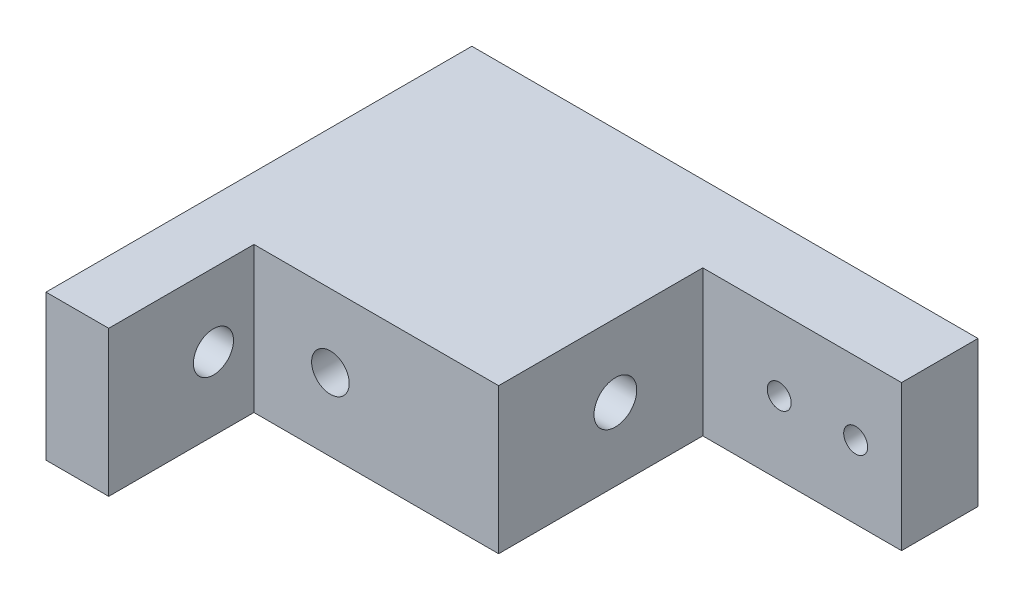
ISO-10303-21;
HEADER;
FILE_DESCRIPTION(('STEP AP214'),'2;1');
FILE_NAME('part.step','',(''),(''),'','','');
FILE_SCHEMA(('AUTOMOTIVE_DESIGN { 1 0 10303 214 1 1 1 1 }'));
ENDSEC;
DATA;
#1=APPLICATION_CONTEXT('core data for automotive mechanical design processes');
#2=APPLICATION_PROTOCOL_DEFINITION('international standard','automotive_design',2000,#1);
#3=PRODUCT_CONTEXT('',#1,'mechanical');
#4=PRODUCT('Part','Part','',(#3));
#5=PRODUCT_RELATED_PRODUCT_CATEGORY('part','',(#4));
#6=PRODUCT_DEFINITION_FORMATION('','',#4);
#7=PRODUCT_DEFINITION_CONTEXT('part definition',#1,'design');
#8=PRODUCT_DEFINITION('design','',#6,#7);
#9=PRODUCT_DEFINITION_SHAPE('','',#8);
#10=(LENGTH_UNIT() NAMED_UNIT(*) SI_UNIT(.MILLI.,.METRE.));
#11=(NAMED_UNIT(*) PLANE_ANGLE_UNIT() SI_UNIT($,.RADIAN.));
#12=(NAMED_UNIT(*) SI_UNIT($,.STERADIAN.) SOLID_ANGLE_UNIT());
#13=UNCERTAINTY_MEASURE_WITH_UNIT(LENGTH_MEASURE(1.E-05),#10,'distance_accuracy_value','');
#14=(GEOMETRIC_REPRESENTATION_CONTEXT(3) GLOBAL_UNCERTAINTY_ASSIGNED_CONTEXT((#13)) GLOBAL_UNIT_ASSIGNED_CONTEXT((#10,
#11,#12)) REPRESENTATION_CONTEXT('',''));
#15=CARTESIAN_POINT('',(0.,0.,0.));
#16=DIRECTION('',(0.,0.,1.));
#17=DIRECTION('',(1.,0.,0.));
#18=AXIS2_PLACEMENT_3D('',#15,#16,#17);
#19=CARTESIAN_POINT('',(-14.5000000000011,0.,18.35));
#20=DIRECTION('',(0.,0.,-1.));
#21=DIRECTION('',(-1.,0.,0.));
#22=AXIS2_PLACEMENT_3D('',#19,#20,#21);
#23=CYLINDRICAL_SURFACE('',#22,1.2295);
#24=CARTESIAN_POINT('',(-15.7295000000011,0.,12.11072));
#25=CARTESIAN_POINT('',(-15.7294971628794,0.0574160828575037,12.1107172084444));
#26=CARTESIAN_POINT('',(-15.725447597035,0.114853620395307,12.1071494421535));
#27=CARTESIAN_POINT('',(-15.7095622145933,0.22779522475085,12.0932001820455));
#28=CARTESIAN_POINT('',(-15.6977200223506,0.283297669158507,12.082813108934));
#29=CARTESIAN_POINT('',(-15.6671756759797,0.390460017000292,12.0561738043992));
#30=CARTESIAN_POINT('',(-15.6485164003282,0.442141561815172,12.0399582434197));
#31=CARTESIAN_POINT('',(-15.6053454161826,0.541112177611661,12.0027538435224));
#32=CARTESIAN_POINT('',(-15.5808315281367,0.588399603624564,11.9817632270883));
#33=CARTESIAN_POINT('',(-15.5163990974183,0.695625552128031,11.9272280341287));
#34=CARTESIAN_POINT('',(-15.4741983708461,0.753324768266293,11.8919770714443));
#35=CARTESIAN_POINT('',(-15.382252384163,0.85921103088047,11.8171650108562));
#36=CARTESIAN_POINT('',(-15.3324877297995,0.907372870275045,11.7775929089871));
#37=CARTESIAN_POINT('',(-15.2252952161145,0.995255821208242,11.6959264647508));
#38=CARTESIAN_POINT('',(-15.1677222171879,1.03476669902257,11.6537956957879));
#39=CARTESIAN_POINT('',(-15.0763071741527,1.08662780090079,11.5921140078755));
#40=CARTESIAN_POINT('',(-15.0450112752951,1.10267392197675,11.5718164730113));
#41=CARTESIAN_POINT('',(-14.9805604123032,1.13224972657545,11.5323919354883));
#42=CARTESIAN_POINT('',(-14.9474068465628,1.14578127073271,11.5132640744302));
#43=CARTESIAN_POINT('',(-14.8782454432165,1.17046137741388,11.4766919129135));
#44=CARTESIAN_POINT('',(-14.8421901224963,1.18154937140915,11.4592952620302));
#45=CARTESIAN_POINT('',(-14.7677341187612,1.20060793588835,11.4282004087307));
#46=CARTESIAN_POINT('',(-14.729337742641,1.2085840425394,11.4144956518676));
#47=CARTESIAN_POINT('',(-14.656613997595,1.21994708356748,11.3944925690182));
#48=CARTESIAN_POINT('',(-14.6226068181303,1.2238611571338,11.3873644202599));
#49=CARTESIAN_POINT('',(-14.5537203978819,1.22880876155988,11.3783006206414));
#50=CARTESIAN_POINT('',(-14.5188428294954,1.22984744310206,11.3763556853378));
#51=CARTESIAN_POINT('',(-14.449235156809,1.22894534761646,11.3780259149758));
#52=CARTESIAN_POINT('',(-14.4145052225802,1.22700176006842,11.3816463247601));
#53=CARTESIAN_POINT('',(-14.3461665448166,1.2203239268568,11.3937673298831));
#54=CARTESIAN_POINT('',(-14.3125602562233,1.21558394528848,11.402277954992));
#55=CARTESIAN_POINT('',(-14.2281902700906,1.20022631305768,11.428849207177));
#56=CARTESIAN_POINT('',(-14.1786264987078,1.18779708988803,11.449587726825));
#57=CARTESIAN_POINT('',(-14.0833809340689,1.157847404093,11.495873334206));
#58=CARTESIAN_POINT('',(-14.0377165315095,1.14030553162739,11.5214404805818));
#59=CARTESIAN_POINT('',(-13.9573580319584,1.10399314572425,11.5702080523947));
#60=CARTESIAN_POINT('',(-13.9221229901944,1.08594521222661,11.5930659836141));
#61=CARTESIAN_POINT('',(-13.8538292117362,1.04674979450679,11.6393803923189));
#62=CARTESIAN_POINT('',(-13.8207717966877,1.02560045264256,11.6628372215212));
#63=CARTESIAN_POINT('',(-13.7248196665767,0.957557390597827,11.7329938451918));
#64=CARTESIAN_POINT('',(-13.6650036404977,0.90600419070033,11.7795720257937));
#65=CARTESIAN_POINT('',(-13.5667134561113,0.80284331834285,11.8584140406088));
#66=CARTESIAN_POINT('',(-13.5264208788622,0.753655888728642,11.891595786182));
#67=CARTESIAN_POINT('',(-13.4528731004327,0.647567944098002,11.9530756547717));
#68=CARTESIAN_POINT('',(-13.4196052951011,0.590681549195058,11.9813825074037));
#69=CARTESIAN_POINT('',(-13.367494812565,0.481665305231734,12.026110031191));
#70=CARTESIAN_POINT('',(-13.3471026696086,0.430790512484509,12.0437730471399));
#71=CARTESIAN_POINT('',(-13.3130100284197,0.325257384327522,12.0734304343933));
#72=CARTESIAN_POINT('',(-13.2993055872832,0.270601300031124,12.0854281456859));
#73=CARTESIAN_POINT('',(-13.2794332916372,0.158555610800743,12.1028560032691));
#74=CARTESIAN_POINT('',(-13.2733089695027,0.101152165318687,12.1082482125802));
#75=CARTESIAN_POINT('',(-13.2692300617506,-0.0141660227984621,12.1118373813138));
#76=CARTESIAN_POINT('',(-13.2712731282219,-0.0720806137163305,12.1100364085884));
#77=CARTESIAN_POINT('',(-13.2827855558014,-0.181058343022418,12.0999175130995));
#78=CARTESIAN_POINT('',(-13.2915475060649,-0.232258216983461,12.0922204489114));
#79=CARTESIAN_POINT('',(-13.3151014483981,-0.332145693061513,12.071619417203));
#80=CARTESIAN_POINT('',(-13.3298949133235,-0.380832678273931,12.0587141778887));
#81=CARTESIAN_POINT('',(-13.365792227337,-0.477556607067068,12.0276001059946));
#82=CARTESIAN_POINT('',(-13.3872159714869,-0.525387007041992,12.0091240478556));
#83=CARTESIAN_POINT('',(-13.4350596333528,-0.616627643180781,11.968264685052));
#84=CARTESIAN_POINT('',(-13.4614805945147,-0.660036953279628,11.9458805644381));
#85=CARTESIAN_POINT('',(-13.5332047037817,-0.763359437949203,11.8859249712742));
#86=CARTESIAN_POINT('',(-13.581233073022,-0.820287336115386,11.8464609105656));
#87=CARTESIAN_POINT('',(-13.6852151785228,-0.923696498379453,11.7638571047708));
#88=CARTESIAN_POINT('',(-13.7412043951293,-0.97012844481608,11.7207012689177));
#89=CARTESIAN_POINT('',(-13.8312156582282,-1.03235885452418,11.6554103570316));
#90=CARTESIAN_POINT('',(-13.8626288346439,-1.05205105579965,11.6332914533623));
#91=CARTESIAN_POINT('',(-13.927405139645,-1.08866452952587,11.5896353300191));
#92=CARTESIAN_POINT('',(-13.9607672661679,-1.10558720921832,11.5680978196042));
#93=CARTESIAN_POINT('',(-14.0294606713015,-1.13651925696257,11.5264938271602));
#94=CARTESIAN_POINT('',(-14.0647822012257,-1.15054164955713,11.5064210427236));
#95=CARTESIAN_POINT('',(-14.1377434484412,-1.17555285993584,11.4688304251084));
#96=CARTESIAN_POINT('',(-14.1753787580722,-1.18654723955969,11.4513079358677));
#97=CARTESIAN_POINT('',(-14.2481327160123,-1.20392756748542,11.4225314452762));
#98=CARTESIAN_POINT('',(-14.2829396037183,-1.21072749941449,11.4107579938049));
#99=CARTESIAN_POINT('',(-14.3542008486416,-1.22135267783463,11.3919717918991));
#100=CARTESIAN_POINT('',(-14.390649529448,-1.22518744901115,11.3849438073805));
#101=CARTESIAN_POINT('',(-14.4648182890826,-1.22956131224226,11.3769041519847));
#102=CARTESIAN_POINT('',(-14.502547426209,-1.23006713117102,11.3759532244615));
#103=CARTESIAN_POINT('',(-14.5775313894619,-1.22762861837186,11.3804591587758));
#104=CARTESIAN_POINT('',(-14.6147854226483,-1.22467913036241,11.3859255971384));
#105=CARTESIAN_POINT('',(-14.6961609594903,-1.21459707746898,11.4040011676949));
#106=CARTESIAN_POINT('',(-14.7398616698676,-1.20665040103913,11.4179770918789));
#107=CARTESIAN_POINT('',(-14.8243631790112,-1.18674288264137,11.4510261459966));
#108=CARTESIAN_POINT('',(-14.8651525663656,-1.17476719465706,11.4701180735345));
#109=CARTESIAN_POINT('',(-14.9395217104356,-1.14885133124427,11.5088502298677));
#110=CARTESIAN_POINT('',(-14.9733960381866,-1.13528436964147,11.5281864752751));
#111=CARTESIAN_POINT('',(-15.0392116048768,-1.10554288010942,11.5681241751178));
#112=CARTESIAN_POINT('',(-15.0711514288259,-1.08936647444567,11.5887265339794));
#113=CARTESIAN_POINT('',(-15.1643736296446,-1.03700216853202,11.6513692305223));
#114=CARTESIAN_POINT('',(-15.2230155554015,-0.996994616548256,11.6942204711286));
#115=CARTESIAN_POINT('',(-15.3365882389955,-0.904145636089737,11.7806857926917));
#116=CARTESIAN_POINT('',(-15.3910930998108,-0.850684140004481,11.8241945816177));
#117=CARTESIAN_POINT('',(-15.490754408494,-0.732139655236624,11.9056582841307));
#118=CARTESIAN_POINT('',(-15.5359387755064,-0.667092494838428,11.9436296815673));
#119=CARTESIAN_POINT('',(-15.6015740460948,-0.548802839545224,11.9994944932316));
#120=CARTESIAN_POINT('',(-15.6252959240962,-0.498559971733186,12.0199076926397));
#121=CARTESIAN_POINT('',(-15.6661311549398,-0.393652434814946,12.0552469940517));
#122=CARTESIAN_POINT('',(-15.6832540047325,-0.338994258139256,12.0701809799338));
#123=CARTESIAN_POINT('',(-15.7073413985709,-0.237071082137791,12.0912487031872));
#124=CARTESIAN_POINT('',(-15.7156098157833,-0.190345538147439,12.0985084625955));
#125=CARTESIAN_POINT('',(-15.7266902109873,-0.0957516119569604,12.1082451974226));
#126=CARTESIAN_POINT('',(-15.7295023660744,-0.0478832669001068,12.1107223280725));
#127=CARTESIAN_POINT('',(-15.7295000000011,0.,12.11072));
#128=B_SPLINE_CURVE_WITH_KNOTS('',3,(#24,#25,#26,#27,#28,#29,#30,#31,#32,#33,#34,#35,#36,#37,
#38,#39,#40,#41,#42,#43,#44,#45,#46,#47,#48,#49,#50,#51,#52,#53,#54,#55,#56,#57,#58,#59,#60,#61,
#62,#63,#64,#65,#66,#67,#68,#69,#70,#71,#72,#73,#74,#75,#76,#77,#78,#79,#80,#81,#82,#83,#84,#85,
#86,#87,#88,#89,#90,#91,#92,#93,#94,#95,#96,#97,#98,#99,#100,#101,#102,#103,#104,#105,#106,#107,
#108,#109,#110,#111,#112,#113,#114,#115,#116,#117,#118,#119,#120,#121,#122,#123,#124,#125,#126,
#127),.UNSPECIFIED.,.T.,.F.,(4,2,2,2,2,2,2,2,2,2,2,2,2,2,2,2,2,2,2,2,2,2,2,2,2,2,2,2,2,2,2,2,2,
2,2,2,2,2,2,2,2,2,2,2,2,2,2,2,2,2,2,4),(0.,0.172043834961801,0.344228605279432,
0.515348496384726,0.686532191480826,0.924341804435361,1.16277179188363,1.40647493732299,
1.52819432498413,1.64982328589981,1.77419300770501,1.8983404509414,2.00280250219559,
2.10707730938603,2.2114504465715,2.31603841976129,2.48054159730912,2.64574380036374,
2.78270693199406,2.91975243769551,3.19330727284085,3.40773493606582,3.62177453179607,
3.79383807695892,3.96580005477482,4.13874508987135,4.31164041136031,4.46847651349755,
4.62535093692799,4.79144930155447,4.95758238678065,5.20910608566094,5.46178813593183,
5.59119728622028,5.7205404759501,5.84928955970604,5.97780055619575,6.08955413406358,
6.20094722853388,6.31345203611031,6.42612494632015,6.56503377364331,6.70446015980026,
6.82818188109059,6.95199303195352,7.19976995029561,7.46223100192175,7.72389406480201,
7.90081324446533,8.07747685264476,8.22096083578924,8.36444016175509),.UNSPECIFIED.);
#129=CARTESIAN_POINT('',(-15.7295000000011,0.,12.11072));
#130=VERTEX_POINT('',#129);
#131=EDGE_CURVE('E42',#130,#130,#128,.T.);
#132=ORIENTED_EDGE('',*,*,#131,.T.);
#133=EDGE_LOOP('',(#132));
#134=FACE_BOUND('',#133,.T.);
#135=CARTESIAN_POINT('',(-14.5000000000011,0.,18.35));
#136=DIRECTION('',(0.,0.,-1.));
#137=DIRECTION('',(-1.,0.,0.));
#138=AXIS2_PLACEMENT_3D('',#135,#136,#137);
#139=CIRCLE('',#138,1.2295);
#140=CARTESIAN_POINT('',(-15.7295000000011,0.,18.35));
#141=VERTEX_POINT('',#140);
#142=EDGE_CURVE('E222',#141,#141,#139,.T.);
#143=ORIENTED_EDGE('',*,*,#142,.F.);
#144=EDGE_LOOP('',(#143));
#145=FACE_BOUND('',#144,.T.);
#146=ADVANCED_FACE('F38',(#134,#145),#23,.F.);
#147=CARTESIAN_POINT('',(-23.6,4.76000000000001,27.85));
#148=DIRECTION('',(-1.,0.,0.));
#149=DIRECTION('',(0.,0.,1.));
#150=AXIS2_PLACEMENT_3D('',#147,#148,#149);
#151=PLANE('',#150);
#152=CARTESIAN_POINT('',(-23.6,0.,10.71372));
#153=DIRECTION('',(-1.,0.,0.));
#154=DIRECTION('',(0.,0.,1.));
#155=AXIS2_PLACEMENT_3D('',#152,#153,#154);
#156=CIRCLE('',#155,1.39699999999999);
#157=CARTESIAN_POINT('',(-23.6,0.,12.11072));
#158=VERTEX_POINT('',#157);
#159=EDGE_CURVE('E179',#158,#158,#156,.T.);
#160=ORIENTED_EDGE('',*,*,#159,.F.);
#161=EDGE_LOOP('',(#160));
#162=FACE_BOUND('',#161,.T.);
#163=CARTESIAN_POINT('',(-23.6,0.,21.));
#164=DIRECTION('',(1.,0.,0.));
#165=DIRECTION('',(0.,1.,0.));
#166=AXIS2_PLACEMENT_3D('',#163,#164,#165);
#167=CIRCLE('',#166,1.3105);
#168=CARTESIAN_POINT('',(-23.6,1.31050000000001,21.));
#169=VERTEX_POINT('',#168);
#170=EDGE_CURVE('E223',#169,#169,#167,.T.);
#171=ORIENTED_EDGE('',*,*,#170,.T.);
#172=EDGE_LOOP('',(#171));
#173=FACE_BOUND('',#172,.T.);
#174=DIRECTION('',(0.,0.,-1.));
#175=VECTOR('',#174,1.);
#176=CARTESIAN_POINT('',(-23.6,-4.75999999999999,27.85));
#177=LINE('',#176,#175);
#178=CARTESIAN_POINT('',(-23.6,-4.75999999999999,27.85));
#179=VERTEX_POINT('',#178);
#180=CARTESIAN_POINT('',(-23.6,-4.75999999999999,0.));
#181=VERTEX_POINT('',#180);
#182=EDGE_CURVE('E149',#179,#181,#177,.T.);
#183=ORIENTED_EDGE('',*,*,#182,.F.);
#184=DIRECTION('',(0.,-1.,0.));
#185=VECTOR('',#184,1.);
#186=CARTESIAN_POINT('',(-23.6,4.76000000000001,27.85));
#187=LINE('',#186,#185);
#188=CARTESIAN_POINT('',(-23.6,4.76000000000001,27.85));
#189=VERTEX_POINT('',#188);
#190=EDGE_CURVE('E11',#189,#179,#187,.T.);
#191=ORIENTED_EDGE('',*,*,#190,.F.);
#192=DIRECTION('',(0.,0.,-1.));
#193=VECTOR('',#192,1.);
#194=CARTESIAN_POINT('',(-23.6,4.76000000000001,27.85));
#195=LINE('',#194,#193);
#196=CARTESIAN_POINT('',(-23.6,4.76000000000001,0.));
#197=VERTEX_POINT('',#196);
#198=EDGE_CURVE('E151',#189,#197,#195,.T.);
#199=ORIENTED_EDGE('',*,*,#198,.T.);
#200=DIRECTION('',(0.,-1.,0.));
#201=VECTOR('',#200,1.);
#202=CARTESIAN_POINT('',(-23.6,4.76000000000001,0.));
#203=LINE('',#202,#201);
#204=EDGE_CURVE('E163',#197,#181,#203,.T.);
#205=ORIENTED_EDGE('',*,*,#204,.T.);
#206=EDGE_LOOP('',(#183,#191,#199,#205));
#207=FACE_BOUND('',#206,.T.);
#208=ADVANCED_FACE('F40',(#162,#173,#207),#151,.T.);
#209=CARTESIAN_POINT('',(9.49999999994784,4.76000000000001,27.85));
#210=DIRECTION('',(0.,0.,1.));
#211=DIRECTION('',(1.,0.,0.));
#212=AXIS2_PLACEMENT_3D('',#209,#210,#211);
#213=PLANE('',#212);
#214=DIRECTION('',(0.,1.,0.));
#215=VECTOR('',#214,1.);
#216=CARTESIAN_POINT('',(-19.5000000000011,-4.76,27.85));
#217=LINE('',#216,#215);
#218=CARTESIAN_POINT('',(-19.5000000000011,-4.76,27.85));
#219=VERTEX_POINT('',#218);
#220=CARTESIAN_POINT('',(-19.5000000000011,4.76000000000001,27.85));
#221=VERTEX_POINT('',#220);
#222=EDGE_CURVE('E115',#219,#221,#217,.T.);
#223=ORIENTED_EDGE('',*,*,#222,.T.);
#224=DIRECTION('',(-1.,0.,0.));
#225=VECTOR('',#224,1.);
#226=CARTESIAN_POINT('',(9.49999999994784,4.76000000000001,27.85));
#227=LINE('',#226,#225);
#228=EDGE_CURVE('E161',#221,#189,#227,.T.);
#229=ORIENTED_EDGE('',*,*,#228,.T.);
#230=ORIENTED_EDGE('',*,*,#190,.T.);
#231=DIRECTION('',(-1.,0.,0.));
#232=VECTOR('',#231,1.);
#233=CARTESIAN_POINT('',(9.49999999994784,-4.75999999999999,27.85));
#234=LINE('',#233,#232);
#235=EDGE_CURVE('E155',#219,#179,#234,.T.);
#236=ORIENTED_EDGE('',*,*,#235,.F.);
#237=EDGE_LOOP('',(#223,#229,#230,#236));
#238=FACE_BOUND('',#237,.T.);
#239=ADVANCED_FACE('F207',(#238),#213,.T.);
#240=CARTESIAN_POINT('',(9.49999999994784,4.76000000000001,0.));
#241=DIRECTION('',(1.,0.,0.));
#242=DIRECTION('',(0.,0.,-1.));
#243=AXIS2_PLACEMENT_3D('',#240,#241,#242);
#244=PLANE('',#243);
#245=DIRECTION('',(0.,1.,0.));
#246=VECTOR('',#245,1.);
#247=CARTESIAN_POINT('',(9.49999999994784,-4.75999999999999,5.00000000070027));
#248=LINE('',#247,#246);
#249=CARTESIAN_POINT('',(9.49999999994784,-4.75999999999999,5.00000000070027));
#250=VERTEX_POINT('',#249);
#251=CARTESIAN_POINT('',(9.49999999994784,4.76000000000001,5.00000000070027));
#252=VERTEX_POINT('',#251);
#253=EDGE_CURVE('E142',#250,#252,#248,.T.);
#254=ORIENTED_EDGE('',*,*,#253,.F.);
#255=DIRECTION('',(0.,0.,1.));
#256=VECTOR('',#255,1.);
#257=CARTESIAN_POINT('',(9.49999999994784,-4.75999999999999,0.));
#258=LINE('',#257,#256);
#259=CARTESIAN_POINT('',(9.49999999994784,-4.75999999999999,0.));
#260=VERTEX_POINT('',#259);
#261=EDGE_CURVE('E169',#260,#250,#258,.T.);
#262=ORIENTED_EDGE('',*,*,#261,.F.);
#263=DIRECTION('',(0.,-1.,0.));
#264=VECTOR('',#263,1.);
#265=CARTESIAN_POINT('',(9.49999999994784,4.76000000000001,0.));
#266=LINE('',#265,#264);
#267=CARTESIAN_POINT('',(9.49999999994784,4.76000000000001,0.));
#268=VERTEX_POINT('',#267);
#269=EDGE_CURVE('E52',#268,#260,#266,.T.);
#270=ORIENTED_EDGE('',*,*,#269,.F.);
#271=DIRECTION('',(0.,0.,1.));
#272=VECTOR('',#271,1.);
#273=CARTESIAN_POINT('',(9.49999999994784,4.76000000000001,0.));
#274=LINE('',#273,#272);
#275=EDGE_CURVE('E158',#268,#252,#274,.T.);
#276=ORIENTED_EDGE('',*,*,#275,.T.);
#277=EDGE_LOOP('',(#254,#262,#270,#276));
#278=FACE_BOUND('',#277,.T.);
#279=ADVANCED_FACE('F274',(#278),#244,.T.);
#280=CARTESIAN_POINT('',(-23.6,4.76000000000001,0.));
#281=DIRECTION('',(0.,0.,-1.));
#282=DIRECTION('',(-1.,0.,0.));
#283=AXIS2_PLACEMENT_3D('',#280,#281,#282);
#284=PLANE('',#283);
#285=CARTESIAN_POINT('',(1.5,0.,0.));
#286=DIRECTION('',(0.,0.,1.));
#287=DIRECTION('',(1.,0.,0.));
#288=AXIS2_PLACEMENT_3D('',#285,#286,#287);
#289=CIRCLE('',#288,0.7835);
#290=CARTESIAN_POINT('',(2.2835,0.,0.));
#291=VERTEX_POINT('',#290);
#292=EDGE_CURVE('E235',#291,#291,#289,.T.);
#293=ORIENTED_EDGE('',*,*,#292,.T.);
#294=EDGE_LOOP('',(#293));
#295=FACE_BOUND('',#294,.T.);
#296=CARTESIAN_POINT('',(6.5,0.,0.));
#297=DIRECTION('',(0.,0.,1.));
#298=DIRECTION('',(1.,0.,0.));
#299=AXIS2_PLACEMENT_3D('',#296,#297,#298);
#300=CIRCLE('',#299,0.7835);
#301=CARTESIAN_POINT('',(7.2835,0.,0.));
#302=VERTEX_POINT('',#301);
#303=EDGE_CURVE('E131',#302,#302,#300,.T.);
#304=ORIENTED_EDGE('',*,*,#303,.T.);
#305=EDGE_LOOP('',(#304));
#306=FACE_BOUND('',#305,.T.);
#307=DIRECTION('',(1.,0.,0.));
#308=VECTOR('',#307,1.);
#309=CARTESIAN_POINT('',(-23.6,-4.75999999999999,0.));
#310=LINE('',#309,#308);
#311=EDGE_CURVE('E166',#181,#260,#310,.T.);
#312=ORIENTED_EDGE('',*,*,#311,.F.);
#313=ORIENTED_EDGE('',*,*,#204,.F.);
#314=DIRECTION('',(1.,0.,0.));
#315=VECTOR('',#314,1.);
#316=CARTESIAN_POINT('',(-23.6,4.76000000000001,0.));
#317=LINE('',#316,#315);
#318=EDGE_CURVE('E154',#197,#268,#317,.T.);
#319=ORIENTED_EDGE('',*,*,#318,.T.);
#320=ORIENTED_EDGE('',*,*,#269,.T.);
#321=EDGE_LOOP('',(#312,#313,#319,#320));
#322=FACE_BOUND('',#321,.T.);
#323=ADVANCED_FACE('F244',(#295,#306,#322),#284,.T.);
#324=CARTESIAN_POINT('',(0.,4.76000000000001,0.));
#325=DIRECTION('',(0.,-1.,0.));
#326=DIRECTION('',(0.,0.,-1.));
#327=AXIS2_PLACEMENT_3D('',#324,#325,#326);
#328=PLANE('',#327);
#329=ORIENTED_EDGE('',*,*,#228,.F.);
#330=DIRECTION('',(0.,0.,1.));
#331=VECTOR('',#330,1.);
#332=CARTESIAN_POINT('',(-19.5000000000011,4.76000000000001,18.35));
#333=LINE('',#332,#331);
#334=CARTESIAN_POINT('',(-19.5000000000011,4.76000000000001,18.35));
#335=VERTEX_POINT('',#334);
#336=EDGE_CURVE('E127',#335,#221,#333,.T.);
#337=ORIENTED_EDGE('',*,*,#336,.F.);
#338=DIRECTION('',(-1.,0.,0.));
#339=VECTOR('',#338,1.);
#340=CARTESIAN_POINT('',(-3.49999999999533,4.76000000000001,18.35));
#341=LINE('',#340,#339);
#342=CARTESIAN_POINT('',(-3.49999999999533,4.76000000000001,18.35));
#343=VERTEX_POINT('',#342);
#344=EDGE_CURVE('E112',#343,#335,#341,.T.);
#345=ORIENTED_EDGE('',*,*,#344,.F.);
#346=DIRECTION('',(0.,0.,1.));
#347=VECTOR('',#346,1.);
#348=CARTESIAN_POINT('',(-3.49999999999533,4.76000000000001,5.00000000070027));
#349=LINE('',#348,#347);
#350=CARTESIAN_POINT('',(-3.49999999999533,4.76000000000001,5.00000000070027));
#351=VERTEX_POINT('',#350);
#352=EDGE_CURVE('E140',#351,#343,#349,.T.);
#353=ORIENTED_EDGE('',*,*,#352,.F.);
#354=DIRECTION('',(-1.,0.,0.));
#355=VECTOR('',#354,1.);
#356=CARTESIAN_POINT('',(9.49999999994784,4.76000000000001,5.00000000070027));
#357=LINE('',#356,#355);
#358=EDGE_CURVE('E135',#252,#351,#357,.T.);
#359=ORIENTED_EDGE('',*,*,#358,.F.);
#360=ORIENTED_EDGE('',*,*,#275,.F.);
#361=ORIENTED_EDGE('',*,*,#318,.F.);
#362=ORIENTED_EDGE('',*,*,#198,.F.);
#363=EDGE_LOOP('',(#329,#337,#345,#353,#359,#360,#361,#362));
#364=FACE_BOUND('',#363,.T.);
#365=ADVANCED_FACE('F266',(#364),#328,.F.);
#366=CARTESIAN_POINT('',(0.,-4.75999999999999,0.));
#367=DIRECTION('',(0.,-1.,0.));
#368=DIRECTION('',(0.,0.,-1.));
#369=AXIS2_PLACEMENT_3D('',#366,#367,#368);
#370=PLANE('',#369);
#371=DIRECTION('',(0.,0.,1.));
#372=VECTOR('',#371,1.);
#373=CARTESIAN_POINT('',(-19.5000000000011,-4.76,18.35));
#374=LINE('',#373,#372);
#375=CARTESIAN_POINT('',(-19.5000000000011,-4.76,18.35));
#376=VERTEX_POINT('',#375);
#377=EDGE_CURVE('E119',#376,#219,#374,.T.);
#378=ORIENTED_EDGE('',*,*,#377,.T.);
#379=ORIENTED_EDGE('',*,*,#235,.T.);
#380=ORIENTED_EDGE('',*,*,#182,.T.);
#381=ORIENTED_EDGE('',*,*,#311,.T.);
#382=ORIENTED_EDGE('',*,*,#261,.T.);
#383=DIRECTION('',(-1.,0.,0.));
#384=VECTOR('',#383,1.);
#385=CARTESIAN_POINT('',(9.49999999994784,-4.75999999999999,5.00000000070027));
#386=LINE('',#385,#384);
#387=CARTESIAN_POINT('',(-3.49999999999533,-4.75999999999999,5.00000000070027));
#388=VERTEX_POINT('',#387);
#389=EDGE_CURVE('E138',#250,#388,#386,.T.);
#390=ORIENTED_EDGE('',*,*,#389,.T.);
#391=DIRECTION('',(0.,0.,1.));
#392=VECTOR('',#391,1.);
#393=CARTESIAN_POINT('',(-3.49999999999533,-4.75999999999999,5.00000000070027));
#394=LINE('',#393,#392);
#395=CARTESIAN_POINT('',(-3.49999999999533,-4.75999999999999,18.35));
#396=VERTEX_POINT('',#395);
#397=EDGE_CURVE('E67',#388,#396,#394,.T.);
#398=ORIENTED_EDGE('',*,*,#397,.T.);
#399=DIRECTION('',(-1.,0.,0.));
#400=VECTOR('',#399,1.);
#401=CARTESIAN_POINT('',(-3.49999999999533,-4.76,18.35));
#402=LINE('',#401,#400);
#403=EDGE_CURVE('E60',#396,#376,#402,.T.);
#404=ORIENTED_EDGE('',*,*,#403,.T.);
#405=EDGE_LOOP('',(#378,#379,#380,#381,#382,#390,#398,#404));
#406=FACE_BOUND('',#405,.T.);
#407=ADVANCED_FACE('F125',(#406),#370,.T.);
#408=CARTESIAN_POINT('',(-3.49999999999533,-4.75999999999999,5.00000000070027));
#409=DIRECTION('',(-1.,0.,0.));
#410=DIRECTION('',(0.,-1.,0.));
#411=AXIS2_PLACEMENT_3D('',#408,#409,#410);
#412=PLANE('',#411);
#413=CARTESIAN_POINT('',(-3.49999999999533,0.,10.71372));
#414=DIRECTION('',(-1.,0.,0.));
#415=DIRECTION('',(0.,-1.,0.));
#416=AXIS2_PLACEMENT_3D('',#413,#414,#415);
#417=CIRCLE('',#416,1.39699999999999);
#418=CARTESIAN_POINT('',(-3.49999999999533,-1.39699999999998,10.71372));
#419=VERTEX_POINT('',#418);
#420=EDGE_CURVE('E408',#419,#419,#417,.T.);
#421=ORIENTED_EDGE('',*,*,#420,.T.);
#422=EDGE_LOOP('',(#421));
#423=FACE_BOUND('',#422,.T.);
#424=ORIENTED_EDGE('',*,*,#352,.T.);
#425=DIRECTION('',(0.,1.,0.));
#426=VECTOR('',#425,1.);
#427=CARTESIAN_POINT('',(-3.49999999999533,-4.76,18.35));
#428=LINE('',#427,#426);
#429=EDGE_CURVE('E116',#396,#343,#428,.T.);
#430=ORIENTED_EDGE('',*,*,#429,.F.);
#431=ORIENTED_EDGE('',*,*,#397,.F.);
#432=DIRECTION('',(0.,1.,0.));
#433=VECTOR('',#432,1.);
#434=CARTESIAN_POINT('',(-3.49999999999533,-4.75999999999999,5.00000000070027));
#435=LINE('',#434,#433);
#436=EDGE_CURVE('E147',#388,#351,#435,.T.);
#437=ORIENTED_EDGE('',*,*,#436,.T.);
#438=EDGE_LOOP('',(#424,#430,#431,#437));
#439=FACE_BOUND('',#438,.T.);
#440=ADVANCED_FACE('F259',(#423,#439),#412,.F.);
#441=CARTESIAN_POINT('',(9.49999999994784,-4.75999999999999,5.00000000070027));
#442=DIRECTION('',(0.,0.,-1.));
#443=DIRECTION('',(0.,1.,0.));
#444=AXIS2_PLACEMENT_3D('',#441,#442,#443);
#445=PLANE('',#444);
#446=CARTESIAN_POINT('',(1.5,0.,5.00000000071035));
#447=DIRECTION('',(0.,0.,1.));
#448=DIRECTION('',(1.,0.,0.));
#449=AXIS2_PLACEMENT_3D('',#446,#447,#448);
#450=CIRCLE('',#449,0.7835);
#451=CARTESIAN_POINT('',(2.2835,0.,5.00000000071035));
#452=VERTEX_POINT('',#451);
#453=EDGE_CURVE('E226',#452,#452,#450,.T.);
#454=ORIENTED_EDGE('',*,*,#453,.F.);
#455=EDGE_LOOP('',(#454));
#456=FACE_BOUND('',#455,.T.);
#457=CARTESIAN_POINT('',(6.5,0.,5.00000000070405));
#458=DIRECTION('',(0.,0.,1.));
#459=DIRECTION('',(1.,0.,0.));
#460=AXIS2_PLACEMENT_3D('',#457,#458,#459);
#461=CIRCLE('',#460,0.7835);
#462=CARTESIAN_POINT('',(7.2835,0.,5.00000000070405));
#463=VERTEX_POINT('',#462);
#464=EDGE_CURVE('E237',#463,#463,#461,.T.);
#465=ORIENTED_EDGE('',*,*,#464,.F.);
#466=EDGE_LOOP('',(#465));
#467=FACE_BOUND('',#466,.T.);
#468=ORIENTED_EDGE('',*,*,#358,.T.);
#469=ORIENTED_EDGE('',*,*,#436,.F.);
#470=ORIENTED_EDGE('',*,*,#389,.F.);
#471=ORIENTED_EDGE('',*,*,#253,.T.);
#472=EDGE_LOOP('',(#468,#469,#470,#471));
#473=FACE_BOUND('',#472,.T.);
#474=ADVANCED_FACE('F256',(#456,#467,#473),#445,.F.);
#475=CARTESIAN_POINT('',(-19.5000000000011,-4.76,18.35));
#476=DIRECTION('',(-1.,0.,0.));
#477=DIRECTION('',(0.,-1.,0.));
#478=AXIS2_PLACEMENT_3D('',#475,#476,#477);
#479=PLANE('',#478);
#480=CARTESIAN_POINT('',(-19.5000000000011,0.,21.));
#481=DIRECTION('',(1.,0.,0.));
#482=DIRECTION('',(0.,1.,0.));
#483=AXIS2_PLACEMENT_3D('',#480,#481,#482);
#484=CIRCLE('',#483,1.3105);
#485=CARTESIAN_POINT('',(-19.5000000000011,1.31050000000001,21.));
#486=VERTEX_POINT('',#485);
#487=EDGE_CURVE('E229',#486,#486,#484,.T.);
#488=ORIENTED_EDGE('',*,*,#487,.F.);
#489=EDGE_LOOP('',(#488));
#490=FACE_BOUND('',#489,.T.);
#491=ORIENTED_EDGE('',*,*,#336,.T.);
#492=ORIENTED_EDGE('',*,*,#222,.F.);
#493=ORIENTED_EDGE('',*,*,#377,.F.);
#494=DIRECTION('',(0.,1.,0.));
#495=VECTOR('',#494,1.);
#496=CARTESIAN_POINT('',(-19.5000000000011,-4.76,18.35));
#497=LINE('',#496,#495);
#498=EDGE_CURVE('E108',#376,#335,#497,.T.);
#499=ORIENTED_EDGE('',*,*,#498,.T.);
#500=EDGE_LOOP('',(#491,#492,#493,#499));
#501=FACE_BOUND('',#500,.T.);
#502=ADVANCED_FACE('F120',(#490,#501),#479,.F.);
#503=CARTESIAN_POINT('',(-3.49999999999533,-4.76,18.35));
#504=DIRECTION('',(0.,0.,-1.));
#505=DIRECTION('',(0.,1.,0.));
#506=AXIS2_PLACEMENT_3D('',#503,#504,#505);
#507=PLANE('',#506);
#508=ORIENTED_EDGE('',*,*,#142,.T.);
#509=EDGE_LOOP('',(#508));
#510=FACE_BOUND('',#509,.T.);
#511=ORIENTED_EDGE('',*,*,#344,.T.);
#512=ORIENTED_EDGE('',*,*,#498,.F.);
#513=ORIENTED_EDGE('',*,*,#403,.F.);
#514=ORIENTED_EDGE('',*,*,#429,.T.);
#515=EDGE_LOOP('',(#511,#512,#513,#514));
#516=FACE_BOUND('',#515,.T.);
#517=ADVANCED_FACE('F110',(#510,#516),#507,.F.);
#518=CARTESIAN_POINT('',(6.5,0.,0.));
#519=DIRECTION('',(0.,0.,1.));
#520=DIRECTION('',(1.,0.,0.));
#521=AXIS2_PLACEMENT_3D('',#518,#519,#520);
#522=CYLINDRICAL_SURFACE('',#521,0.7835);
#523=ORIENTED_EDGE('',*,*,#303,.F.);
#524=EDGE_LOOP('',(#523));
#525=FACE_BOUND('',#524,.T.);
#526=ORIENTED_EDGE('',*,*,#464,.T.);
#527=EDGE_LOOP('',(#526));
#528=FACE_BOUND('',#527,.T.);
#529=ADVANCED_FACE('F197',(#525,#528),#522,.F.);
#530=CARTESIAN_POINT('',(1.5,0.,0.));
#531=DIRECTION('',(0.,0.,1.));
#532=DIRECTION('',(1.,0.,0.));
#533=AXIS2_PLACEMENT_3D('',#530,#531,#532);
#534=CYLINDRICAL_SURFACE('',#533,0.7835);
#535=ORIENTED_EDGE('',*,*,#292,.F.);
#536=EDGE_LOOP('',(#535));
#537=FACE_BOUND('',#536,.T.);
#538=ORIENTED_EDGE('',*,*,#453,.T.);
#539=EDGE_LOOP('',(#538));
#540=FACE_BOUND('',#539,.T.);
#541=ADVANCED_FACE('F192',(#537,#540),#534,.F.);
#542=CARTESIAN_POINT('',(-23.6,0.,21.));
#543=DIRECTION('',(1.,0.,0.));
#544=DIRECTION('',(0.,1.,0.));
#545=AXIS2_PLACEMENT_3D('',#542,#543,#544);
#546=CYLINDRICAL_SURFACE('',#545,1.3105);
#547=ORIENTED_EDGE('',*,*,#170,.F.);
#548=EDGE_LOOP('',(#547));
#549=FACE_BOUND('',#548,.T.);
#550=ORIENTED_EDGE('',*,*,#487,.T.);
#551=EDGE_LOOP('',(#550));
#552=FACE_BOUND('',#551,.T.);
#553=ADVANCED_FACE('F188',(#549,#552),#546,.F.);
#554=CARTESIAN_POINT('',(-23.6,0.,10.71372));
#555=DIRECTION('',(-1.,0.,0.));
#556=DIRECTION('',(0.,0.,1.));
#557=AXIS2_PLACEMENT_3D('',#554,#555,#556);
#558=CYLINDRICAL_SURFACE('',#557,1.39699999999999);
#559=ORIENTED_EDGE('',*,*,#131,.F.);
#560=EDGE_LOOP('',(#559));
#561=FACE_BOUND('',#560,.T.);
#562=ORIENTED_EDGE('',*,*,#159,.T.);
#563=EDGE_LOOP('',(#562));
#564=FACE_BOUND('',#563,.T.);
#565=CARTESIAN_POINT('',(-15.7295000000011,0.,9.31672000000001));
#566=CARTESIAN_POINT('',(-15.7294971628794,-0.0574160828575041,9.3167227915556));
#567=CARTESIAN_POINT('',(-15.725447597035,-0.114853620395307,9.32029055784652));
#568=CARTESIAN_POINT('',(-15.7095622145933,-0.22779522475085,9.3342398179545));
#569=CARTESIAN_POINT('',(-15.6977200223506,-0.283297669158508,9.34462689106598));
#570=CARTESIAN_POINT('',(-15.6671756759797,-0.390460017000292,9.37126619560079));
#571=CARTESIAN_POINT('',(-15.6485164003282,-0.442141561815171,9.3874817565803));
#572=CARTESIAN_POINT('',(-15.6053454161826,-0.54111217761166,9.42468615647758));
#573=CARTESIAN_POINT('',(-15.5808315281367,-0.588399603624563,9.44567677291175));
#574=CARTESIAN_POINT('',(-15.5163990974183,-0.695625552128031,9.50021196587133));
#575=CARTESIAN_POINT('',(-15.4741983708461,-0.753324768266294,9.53546292855571));
#576=CARTESIAN_POINT('',(-15.382252384163,-0.859211030880471,9.61027498914379));
#577=CARTESIAN_POINT('',(-15.3324877297995,-0.907372870275046,9.64984709101294));
#578=CARTESIAN_POINT('',(-15.2252952161145,-0.995255821208244,9.7315135352492));
#579=CARTESIAN_POINT('',(-15.1677222171879,-1.03476669902257,9.77364430421212));
#580=CARTESIAN_POINT('',(-15.0763071741527,-1.08662780090079,9.83532599212448));
#581=CARTESIAN_POINT('',(-15.0450112752951,-1.10267392197675,9.85562352698872));
#582=CARTESIAN_POINT('',(-14.9805604123032,-1.13224972657545,9.89504806451168));
#583=CARTESIAN_POINT('',(-14.9474068465628,-1.14578127073271,9.91417592556978));
#584=CARTESIAN_POINT('',(-14.8782454432165,-1.17046137741388,9.95074808708655));
#585=CARTESIAN_POINT('',(-14.8421901224963,-1.18154937140915,9.96814473796985));
#586=CARTESIAN_POINT('',(-14.7677341187612,-1.20060793588835,9.99923959126931));
#587=CARTESIAN_POINT('',(-14.729337742641,-1.2085840425394,10.0129443481324));
#588=CARTESIAN_POINT('',(-14.656613997595,-1.21994708356748,10.0329474309818));
#589=CARTESIAN_POINT('',(-14.6226068181303,-1.2238611571338,10.0400755797402));
#590=CARTESIAN_POINT('',(-14.5537203978819,-1.22880876155988,10.0491393793587));
#591=CARTESIAN_POINT('',(-14.5188428294954,-1.22984744310206,10.0510843146622));
#592=CARTESIAN_POINT('',(-14.449235156809,-1.22894534761646,10.0494140850242));
#593=CARTESIAN_POINT('',(-14.4145052225802,-1.22700176006843,10.0457936752399));
#594=CARTESIAN_POINT('',(-14.3461665448166,-1.2203239268568,10.033672670117));
#595=CARTESIAN_POINT('',(-14.3125602562233,-1.21558394528848,10.0251620450081));
#596=CARTESIAN_POINT('',(-14.2281902700906,-1.20022631305768,9.99859079282304));
#597=CARTESIAN_POINT('',(-14.1786264987079,-1.18779708988804,9.97785227317502));
#598=CARTESIAN_POINT('',(-14.0833809340689,-1.15784740409301,9.93156666579408));
#599=CARTESIAN_POINT('',(-14.0377165315095,-1.14030553162741,9.90599951941824));
#600=CARTESIAN_POINT('',(-13.9573580319585,-1.10399314572426,9.85723194760533));
#601=CARTESIAN_POINT('',(-13.9221229901945,-1.08594521222663,9.83437401638594));
#602=CARTESIAN_POINT('',(-13.8538292117363,-1.04674979450681,9.78805960768117));
#603=CARTESIAN_POINT('',(-13.8207717966878,-1.02560045264258,9.76460277847885));
#604=CARTESIAN_POINT('',(-13.7248196665767,-0.957557390597852,9.6944461548082));
#605=CARTESIAN_POINT('',(-13.6650036404978,-0.906004190700356,9.6478679742063));
#606=CARTESIAN_POINT('',(-13.5667134561114,-0.80284331834288,9.56902595939122));
#607=CARTESIAN_POINT('',(-13.5264208788622,-0.753655888728672,9.53584421381803));
#608=CARTESIAN_POINT('',(-13.4528731004327,-0.647567944098031,9.4743643452283));
#609=CARTESIAN_POINT('',(-13.4196052951011,-0.590681549195087,9.44605749259632));
#610=CARTESIAN_POINT('',(-13.367494812565,-0.481665305231761,9.40132996880906));
#611=CARTESIAN_POINT('',(-13.3471026696086,-0.430790512484535,9.38366695286011));
#612=CARTESIAN_POINT('',(-13.3130100284197,-0.325257384327548,9.35400956560675));
#613=CARTESIAN_POINT('',(-13.2993055872832,-0.27060130003115,9.34201185431406));
#614=CARTESIAN_POINT('',(-13.2794332916372,-0.158555610800769,9.3245839967309));
#615=CARTESIAN_POINT('',(-13.2733089695027,-0.101152165318712,9.3191917874198));
#616=CARTESIAN_POINT('',(-13.2692300617506,0.0141660227984379,9.31560261868623));
#617=CARTESIAN_POINT('',(-13.2712731282219,0.0720806137163071,9.31740359141155));
#618=CARTESIAN_POINT('',(-13.2827855558014,0.181058343022396,9.32752248690048));
#619=CARTESIAN_POINT('',(-13.2915475060649,0.232258216983439,9.3352195510886));
#620=CARTESIAN_POINT('',(-13.3151014483981,0.332145693061493,9.35582058279703));
#621=CARTESIAN_POINT('',(-13.3298949133235,0.380832678273911,9.36872582211125));
#622=CARTESIAN_POINT('',(-13.365792227337,0.477556607067049,9.3998398940054));
#623=CARTESIAN_POINT('',(-13.3872159714869,0.525387007041974,9.41831595214435));
#624=CARTESIAN_POINT('',(-13.4350596333528,0.616627643180764,9.45917531494795));
#625=CARTESIAN_POINT('',(-13.4614805945147,0.660036953279611,9.4815594355619));
#626=CARTESIAN_POINT('',(-13.5332047037817,0.763359437949186,9.54151502872579));
#627=CARTESIAN_POINT('',(-13.581233073022,0.820287336115368,9.58097908943436));
#628=CARTESIAN_POINT('',(-13.6852151785228,0.923696498379436,9.66358289522919));
#629=CARTESIAN_POINT('',(-13.7412043951293,0.970128444816064,9.70673873108228));
#630=CARTESIAN_POINT('',(-13.8312156582281,1.03235885452417,9.77202964296836));
#631=CARTESIAN_POINT('',(-13.8626288346438,1.05205105579964,9.7941485466377));
#632=CARTESIAN_POINT('',(-13.9274051396449,1.08866452952586,9.83780466998089));
#633=CARTESIAN_POINT('',(-13.9607672661678,1.1055872092183,9.8593421803958));
#634=CARTESIAN_POINT('',(-14.0294606713015,1.13651925696256,9.90094617283978));
#635=CARTESIAN_POINT('',(-14.0647822012256,1.15054164955712,9.92101895727638));
#636=CARTESIAN_POINT('',(-14.1377434484412,1.17555285993583,9.95860957489156));
#637=CARTESIAN_POINT('',(-14.1753787580722,1.18654723955968,9.97613206413224));
#638=CARTESIAN_POINT('',(-14.2481327160122,1.20392756748541,10.0049085547238));
#639=CARTESIAN_POINT('',(-14.2829396037182,1.21072749941449,10.016682006195));
#640=CARTESIAN_POINT('',(-14.3542008486416,1.22135267783463,10.0354682081009));
#641=CARTESIAN_POINT('',(-14.3906495294479,1.22518744901115,10.0424961926194));
#642=CARTESIAN_POINT('',(-14.4648182890826,1.22956131224226,10.0505358480153));
#643=CARTESIAN_POINT('',(-14.502547426209,1.23006713117102,10.0514867755385));
#644=CARTESIAN_POINT('',(-14.5775313894618,1.22762861837186,10.0469808412242));
#645=CARTESIAN_POINT('',(-14.6147854226483,1.22467913036241,10.0415144028616));
#646=CARTESIAN_POINT('',(-14.6961609594903,1.21459707746898,10.0234388323051));
#647=CARTESIAN_POINT('',(-14.7398616698676,1.20665040103913,10.009462908121));
#648=CARTESIAN_POINT('',(-14.8243631790112,1.18674288264138,9.97641385400335));
#649=CARTESIAN_POINT('',(-14.8651525663656,1.17476719465706,9.9573219264655));
#650=CARTESIAN_POINT('',(-14.9395217104356,1.14885133124427,9.91858977013225));
#651=CARTESIAN_POINT('',(-14.9733960381866,1.13528436964147,9.89925352472491));
#652=CARTESIAN_POINT('',(-15.0392116048768,1.10554288010942,9.85931582488216));
#653=CARTESIAN_POINT('',(-15.0711514288259,1.08936647444568,9.83871346602057));
#654=CARTESIAN_POINT('',(-15.1643736296446,1.03700216853203,9.77607076947767));
#655=CARTESIAN_POINT('',(-15.2230155554015,0.99699461654827,9.73321952887142));
#656=CARTESIAN_POINT('',(-15.3365882389954,0.904145636089754,9.64675420730832));
#657=CARTESIAN_POINT('',(-15.3910930998107,0.850684140004502,9.60324541838229));
#658=CARTESIAN_POINT('',(-15.490754408494,0.732139655236651,9.52178171586929));
#659=CARTESIAN_POINT('',(-15.5359387755063,0.667092494838458,9.48381031843275));
#660=CARTESIAN_POINT('',(-15.6015740460948,0.548802839545258,9.42794550676843));
#661=CARTESIAN_POINT('',(-15.6252959240962,0.49855997173322,9.40753230736029));
#662=CARTESIAN_POINT('',(-15.6661311549398,0.393652434814981,9.37219300594833));
#663=CARTESIAN_POINT('',(-15.6832540047325,0.338994258139291,9.35725902006624));
#664=CARTESIAN_POINT('',(-15.7073413985709,0.237071082137821,9.33619129681285));
#665=CARTESIAN_POINT('',(-15.7156098157833,0.190345538147463,9.32893153740446));
#666=CARTESIAN_POINT('',(-15.7266902109873,0.095751611956973,9.31919480257738));
#667=CARTESIAN_POINT('',(-15.7295023660744,0.0478832669001131,9.31671767192754));
#668=CARTESIAN_POINT('',(-15.7295000000011,0.,9.31672000000001));
#669=B_SPLINE_CURVE_WITH_KNOTS('',3,(#565,#566,#567,#568,#569,#570,#571,#572,#573,#574,#575,
#576,#577,#578,#579,#580,#581,#582,#583,#584,#585,#586,#587,#588,#589,#590,#591,#592,#593,#594,
#595,#596,#597,#598,#599,#600,#601,#602,#603,#604,#605,#606,#607,#608,#609,#610,#611,#612,#613,
#614,#615,#616,#617,#618,#619,#620,#621,#622,#623,#624,#625,#626,#627,#628,#629,#630,#631,#632,
#633,#634,#635,#636,#637,#638,#639,#640,#641,#642,#643,#644,#645,#646,#647,#648,#649,#650,#651,
#652,#653,#654,#655,#656,#657,#658,#659,#660,#661,#662,#663,#664,#665,#666,#667,#668),
.UNSPECIFIED.,.T.,.F.,(4,2,2,2,2,2,2,2,2,2,2,2,2,2,2,2,2,2,2,2,2,2,2,2,2,2,2,2,2,2,2,2,2,2,2,2,
2,2,2,2,2,2,2,2,2,2,2,2,2,2,2,4),(0.,0.172043834961802,0.344228605279433,0.515348496384725,
0.686532191480827,0.924341804435365,1.16277179188364,1.406474937323,1.52819432498414,
1.64982328589982,1.77419300770502,1.8983404509414,2.00280250219559,2.10707730938603,
2.2114504465715,2.31603841976129,2.4805415973091,2.64574380036371,2.78270693199403,
2.91975243769548,3.19330727284082,3.4077349360658,3.62177453179606,3.79383807695892,
3.96580005477482,4.13874508987135,4.31164041136031,4.46847651349755,4.62535093692799,
4.79144930155447,4.95758238678064,5.20910608566093,5.46178813593181,5.59119728622026,
5.72054047595008,5.84928955970602,5.97780055619572,6.08955413406355,6.20094722853386,
6.3134520361103,6.42612494632015,6.56503377364331,6.70446015980026,6.82818188109057,
6.9519930319535,7.19976995029558,7.46223100192171,7.72389406480197,7.90081324446529,
8.07747685264473,8.22096083578922,8.36444016175509),.UNSPECIFIED.);
#670=CARTESIAN_POINT('',(-15.7295000000011,0.,9.31672000000001));
#671=VERTEX_POINT('',#670);
#672=EDGE_CURVE('E174',#671,#671,#669,.T.);
#673=ORIENTED_EDGE('',*,*,#672,.F.);
#674=EDGE_LOOP('',(#673));
#675=FACE_BOUND('',#674,.T.);
#676=ORIENTED_EDGE('',*,*,#420,.F.);
#677=EDGE_LOOP('',(#676));
#678=FACE_BOUND('',#677,.T.);
#679=ADVANCED_FACE('F184',(#561,#564,#675,#678),#558,.F.);
#680=CARTESIAN_POINT('',(-14.5000000000011,0.,8.34999999999999));
#681=DIRECTION('',(0.,0.,-1.));
#682=DIRECTION('',(-1.,0.,0.));
#683=AXIS2_PLACEMENT_3D('',#680,#681,#682);
#684=PLANE('',#683);
#685=CARTESIAN_POINT('',(-14.5000000000011,0.,8.34999999999999));
#686=DIRECTION('',(0.,0.,-1.));
#687=DIRECTION('',(-1.,0.,0.));
#688=AXIS2_PLACEMENT_3D('',#685,#686,#687);
#689=CIRCLE('',#688,1.2295);
#690=CARTESIAN_POINT('',(-15.7295000000011,0.,8.34999999999999));
#691=VERTEX_POINT('',#690);
#692=EDGE_CURVE('E221',#691,#691,#689,.T.);
#693=ORIENTED_EDGE('',*,*,#692,.F.);
#694=EDGE_LOOP('',(#693));
#695=FACE_BOUND('',#694,.T.);
#696=ADVANCED_FACE('F187',(#695),#684,.F.);
#697=ORIENTED_EDGE('',*,*,#672,.T.);
#698=EDGE_LOOP('',(#697));
#699=FACE_BOUND('',#698,.T.);
#700=ORIENTED_EDGE('',*,*,#692,.T.);
#701=EDGE_LOOP('',(#700));
#702=FACE_BOUND('',#701,.T.);
#703=ADVANCED_FACE('F180',(#699,#702),#23,.F.);
#704=CLOSED_SHELL('',(#146,#208,#239,#279,#323,#365,#407,#440,#474,#502,#517,#529,#541,#553,
#679,#696,#703));
#705=MANIFOLD_SOLID_BREP('B2',#704);
#706=ADVANCED_BREP_SHAPE_REPRESENTATION('',(#18,#705),#14);
#707=SHAPE_DEFINITION_REPRESENTATION(#9,#706);
ENDSEC;
END-ISO-10303-21;
